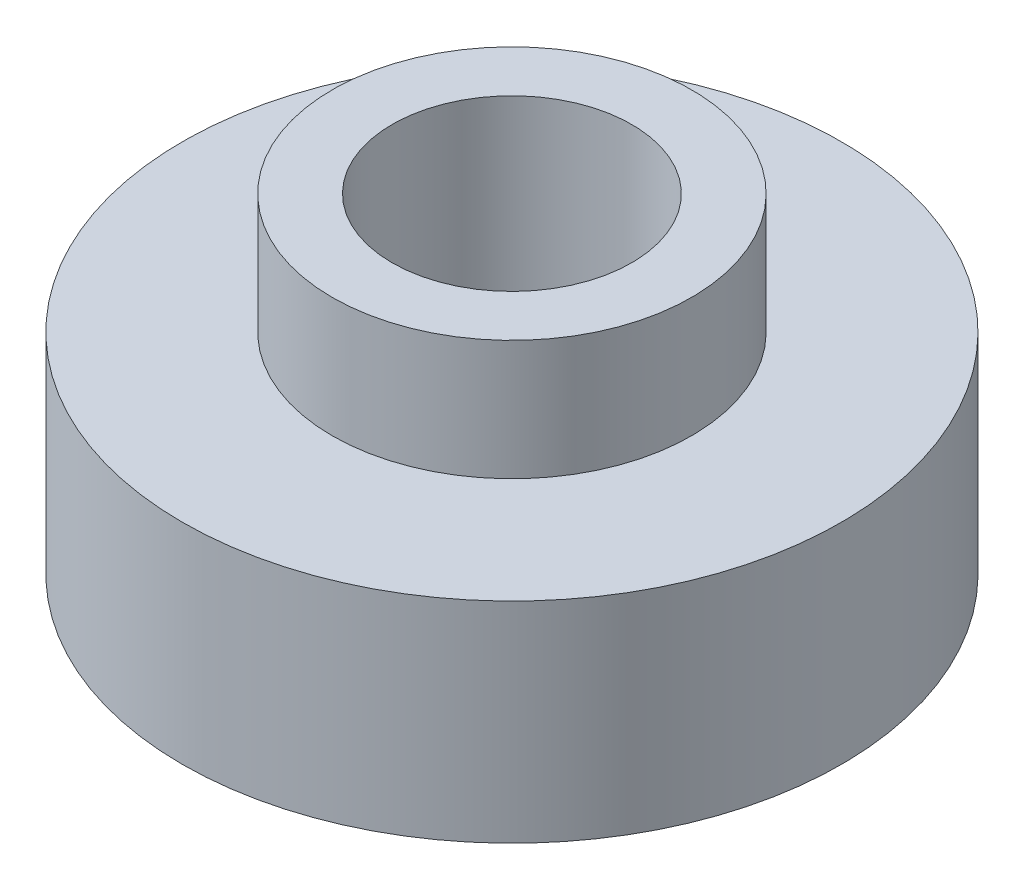
ISO-10303-21;
HEADER;
FILE_DESCRIPTION(('STEP AP214'),'2;1');
FILE_NAME('part.step','',(''),(''),'','','');
FILE_SCHEMA(('AUTOMOTIVE_DESIGN { 1 0 10303 214 1 1 1 1 }'));
ENDSEC;
DATA;
#1=APPLICATION_CONTEXT('core data for automotive mechanical design processes');
#2=APPLICATION_PROTOCOL_DEFINITION('international standard','automotive_design',2000,#1);
#3=PRODUCT_CONTEXT('',#1,'mechanical');
#4=PRODUCT('Part','Part','',(#3));
#5=PRODUCT_RELATED_PRODUCT_CATEGORY('part','',(#4));
#6=PRODUCT_DEFINITION_FORMATION('','',#4);
#7=PRODUCT_DEFINITION_CONTEXT('part definition',#1,'design');
#8=PRODUCT_DEFINITION('design','',#6,#7);
#9=PRODUCT_DEFINITION_SHAPE('','',#8);
#10=(LENGTH_UNIT() NAMED_UNIT(*) SI_UNIT(.MILLI.,.METRE.));
#11=(NAMED_UNIT(*) PLANE_ANGLE_UNIT() SI_UNIT($,.RADIAN.));
#12=(NAMED_UNIT(*) SI_UNIT($,.STERADIAN.) SOLID_ANGLE_UNIT());
#13=UNCERTAINTY_MEASURE_WITH_UNIT(LENGTH_MEASURE(1.E-05),#10,'distance_accuracy_value','');
#14=(GEOMETRIC_REPRESENTATION_CONTEXT(3) GLOBAL_UNCERTAINTY_ASSIGNED_CONTEXT((#13)) GLOBAL_UNIT_ASSIGNED_CONTEXT((#10,
#11,#12)) REPRESENTATION_CONTEXT('',''));
#15=CARTESIAN_POINT('',(0.,0.,0.));
#16=DIRECTION('',(0.,0.,1.));
#17=DIRECTION('',(1.,0.,0.));
#18=AXIS2_PLACEMENT_3D('',#15,#16,#17);
#19=CARTESIAN_POINT('',(0.,7.,0.));
#20=DIRECTION('',(0.,-1.,0.));
#21=DIRECTION('',(0.,0.,-1.));
#22=AXIS2_PLACEMENT_3D('',#19,#20,#21);
#23=CYLINDRICAL_SURFACE('',#22,11.);
#24=CARTESIAN_POINT('',(0.,7.,0.));
#25=DIRECTION('',(0.,1.,0.));
#26=DIRECTION('',(0.,0.,1.));
#27=AXIS2_PLACEMENT_3D('',#24,#25,#26);
#28=CIRCLE('',#27,11.);
#29=CARTESIAN_POINT('',(0.,7.,11.));
#30=VERTEX_POINT('',#29);
#31=EDGE_CURVE('E49',#30,#30,#28,.T.);
#32=ORIENTED_EDGE('',*,*,#31,.F.);
#33=EDGE_LOOP('',(#32));
#34=FACE_BOUND('',#33,.T.);
#35=CARTESIAN_POINT('',(0.,0.,0.));
#36=DIRECTION('',(0.,1.,0.));
#37=DIRECTION('',(0.,0.,1.));
#38=AXIS2_PLACEMENT_3D('',#35,#36,#37);
#39=CIRCLE('',#38,11.);
#40=CARTESIAN_POINT('',(0.,0.,11.));
#41=VERTEX_POINT('',#40);
#42=EDGE_CURVE('E44',#41,#41,#39,.T.);
#43=ORIENTED_EDGE('',*,*,#42,.T.);
#44=EDGE_LOOP('',(#43));
#45=FACE_BOUND('',#44,.T.);
#46=ADVANCED_FACE('F41',(#34,#45),#23,.T.);
#47=CARTESIAN_POINT('',(0.,7.,0.));
#48=DIRECTION('',(0.,1.,0.));
#49=DIRECTION('',(0.,0.,1.));
#50=AXIS2_PLACEMENT_3D('',#47,#48,#49);
#51=PLANE('',#50);
#52=CARTESIAN_POINT('',(0.,7.,0.));
#53=DIRECTION('',(0.,1.,0.));
#54=DIRECTION('',(0.,0.,1.));
#55=AXIS2_PLACEMENT_3D('',#52,#53,#54);
#56=CIRCLE('',#55,6.);
#57=CARTESIAN_POINT('',(0.,7.,6.));
#58=VERTEX_POINT('',#57);
#59=EDGE_CURVE('E10',#58,#58,#56,.T.);
#60=ORIENTED_EDGE('',*,*,#59,.F.);
#61=EDGE_LOOP('',(#60));
#62=FACE_BOUND('',#61,.T.);
#63=ORIENTED_EDGE('',*,*,#31,.T.);
#64=EDGE_LOOP('',(#63));
#65=FACE_BOUND('',#64,.T.);
#66=ADVANCED_FACE('F90',(#62,#65),#51,.T.);
#67=CARTESIAN_POINT('',(0.,0.,0.));
#68=DIRECTION('',(0.,1.,0.));
#69=DIRECTION('',(0.,0.,1.));
#70=AXIS2_PLACEMENT_3D('',#67,#68,#69);
#71=PLANE('',#70);
#72=CARTESIAN_POINT('',(0.,0.,0.));
#73=DIRECTION('',(0.,1.,0.));
#74=DIRECTION('',(0.,0.,1.));
#75=AXIS2_PLACEMENT_3D('',#72,#73,#74);
#76=CIRCLE('',#75,4.);
#77=CARTESIAN_POINT('',(0.,0.,4.));
#78=VERTEX_POINT('',#77);
#79=EDGE_CURVE('E60',#78,#78,#76,.T.);
#80=ORIENTED_EDGE('',*,*,#79,.T.);
#81=EDGE_LOOP('',(#80));
#82=FACE_BOUND('',#81,.T.);
#83=ORIENTED_EDGE('',*,*,#42,.F.);
#84=EDGE_LOOP('',(#83));
#85=FACE_BOUND('',#84,.T.);
#86=ADVANCED_FACE('F69',(#82,#85),#71,.F.);
#87=CARTESIAN_POINT('',(0.,11.,0.));
#88=DIRECTION('',(0.,-1.,0.));
#89=DIRECTION('',(0.,0.,-1.));
#90=AXIS2_PLACEMENT_3D('',#87,#88,#89);
#91=CYLINDRICAL_SURFACE('',#90,6.);
#92=CARTESIAN_POINT('',(0.,11.,0.));
#93=DIRECTION('',(0.,1.,0.));
#94=DIRECTION('',(0.,0.,1.));
#95=AXIS2_PLACEMENT_3D('',#92,#93,#94);
#96=CIRCLE('',#95,6.);
#97=CARTESIAN_POINT('',(0.,11.,6.));
#98=VERTEX_POINT('',#97);
#99=EDGE_CURVE('E56',#98,#98,#96,.T.);
#100=ORIENTED_EDGE('',*,*,#99,.F.);
#101=EDGE_LOOP('',(#100));
#102=FACE_BOUND('',#101,.T.);
#103=ORIENTED_EDGE('',*,*,#59,.T.);
#104=EDGE_LOOP('',(#103));
#105=FACE_BOUND('',#104,.T.);
#106=ADVANCED_FACE('F81',(#102,#105),#91,.T.);
#107=CARTESIAN_POINT('',(0.,11.,0.));
#108=DIRECTION('',(0.,1.,0.));
#109=DIRECTION('',(0.,0.,1.));
#110=AXIS2_PLACEMENT_3D('',#107,#108,#109);
#111=PLANE('',#110);
#112=CARTESIAN_POINT('',(0.,11.,0.));
#113=DIRECTION('',(0.,1.,0.));
#114=DIRECTION('',(0.,0.,1.));
#115=AXIS2_PLACEMENT_3D('',#112,#113,#114);
#116=CIRCLE('',#115,4.);
#117=CARTESIAN_POINT('',(0.,11.,4.));
#118=VERTEX_POINT('',#117);
#119=EDGE_CURVE('E61',#118,#118,#116,.T.);
#120=ORIENTED_EDGE('',*,*,#119,.F.);
#121=EDGE_LOOP('',(#120));
#122=FACE_BOUND('',#121,.T.);
#123=ORIENTED_EDGE('',*,*,#99,.T.);
#124=EDGE_LOOP('',(#123));
#125=FACE_BOUND('',#124,.T.);
#126=ADVANCED_FACE('F75',(#122,#125),#111,.T.);
#127=CARTESIAN_POINT('',(0.,0.,0.));
#128=DIRECTION('',(0.,1.,0.));
#129=DIRECTION('',(0.,0.,1.));
#130=AXIS2_PLACEMENT_3D('',#127,#128,#129);
#131=CYLINDRICAL_SURFACE('',#130,4.);
#132=ORIENTED_EDGE('',*,*,#79,.F.);
#133=EDGE_LOOP('',(#132));
#134=FACE_BOUND('',#133,.T.);
#135=ORIENTED_EDGE('',*,*,#119,.T.);
#136=EDGE_LOOP('',(#135));
#137=FACE_BOUND('',#136,.T.);
#138=ADVANCED_FACE('F72',(#134,#137),#131,.F.);
#139=CLOSED_SHELL('',(#46,#66,#86,#106,#126,#138));
#140=MANIFOLD_SOLID_BREP('B2',#139);
#141=ADVANCED_BREP_SHAPE_REPRESENTATION('',(#18,#140),#14);
#142=SHAPE_DEFINITION_REPRESENTATION(#9,#141);
ENDSEC;
END-ISO-10303-21;
